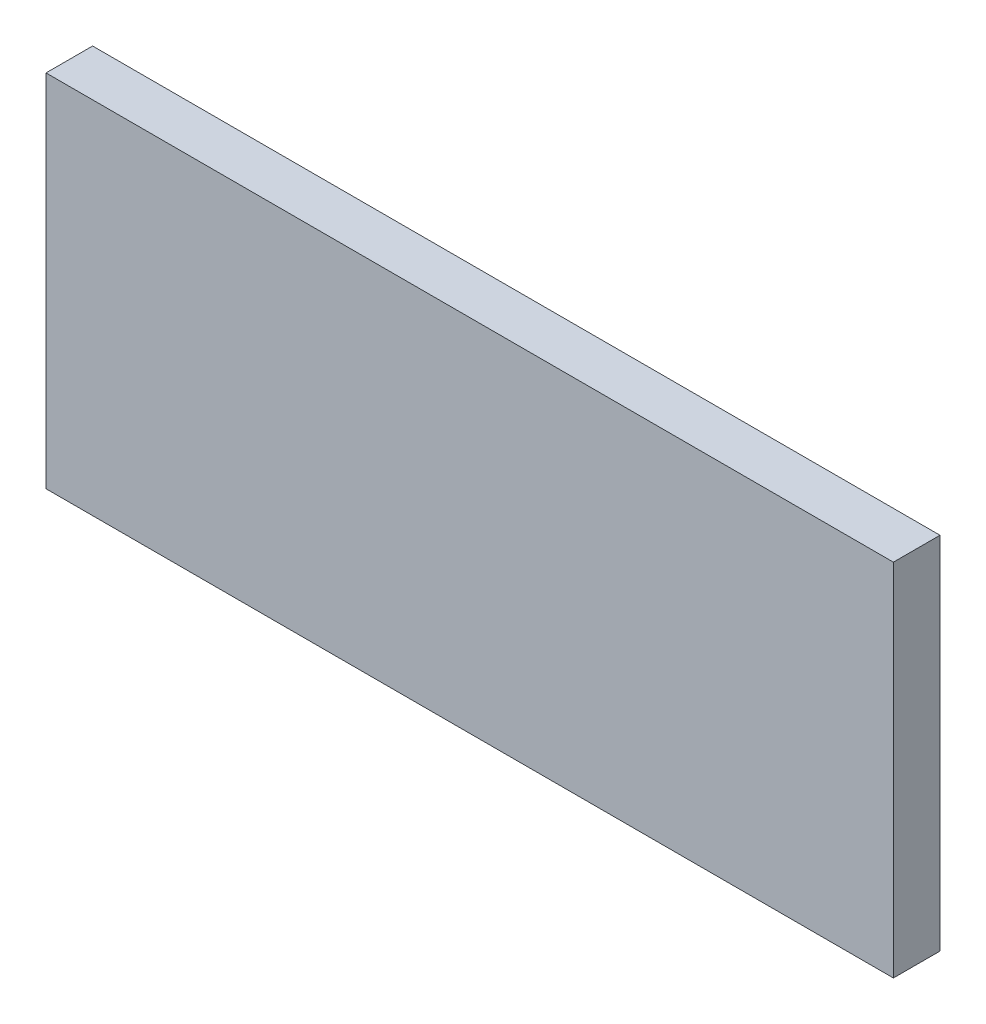
ISO-10303-21;
HEADER;
FILE_DESCRIPTION(('STEP AP214'),'2;1');
FILE_NAME('part.step','',(''),(''),'','','');
FILE_SCHEMA(('AUTOMOTIVE_DESIGN { 1 0 10303 214 1 1 1 1 }'));
ENDSEC;
DATA;
#1=APPLICATION_CONTEXT('core data for automotive mechanical design processes');
#2=APPLICATION_PROTOCOL_DEFINITION('international standard','automotive_design',2000,#1);
#3=PRODUCT_CONTEXT('',#1,'mechanical');
#4=PRODUCT('Part','Part','',(#3));
#5=PRODUCT_RELATED_PRODUCT_CATEGORY('part','',(#4));
#6=PRODUCT_DEFINITION_FORMATION('','',#4);
#7=PRODUCT_DEFINITION_CONTEXT('part definition',#1,'design');
#8=PRODUCT_DEFINITION('design','',#6,#7);
#9=PRODUCT_DEFINITION_SHAPE('','',#8);
#10=(LENGTH_UNIT() NAMED_UNIT(*) SI_UNIT(.MILLI.,.METRE.));
#11=(NAMED_UNIT(*) PLANE_ANGLE_UNIT() SI_UNIT($,.RADIAN.));
#12=(NAMED_UNIT(*) SI_UNIT($,.STERADIAN.) SOLID_ANGLE_UNIT());
#13=UNCERTAINTY_MEASURE_WITH_UNIT(LENGTH_MEASURE(1.E-05),#10,'distance_accuracy_value','');
#14=(GEOMETRIC_REPRESENTATION_CONTEXT(3) GLOBAL_UNCERTAINTY_ASSIGNED_CONTEXT((#13)) GLOBAL_UNIT_ASSIGNED_CONTEXT((#10,
#11,#12)) REPRESENTATION_CONTEXT('',''));
#15=CARTESIAN_POINT('',(0.,0.,0.));
#16=DIRECTION('',(0.,0.,1.));
#17=DIRECTION('',(1.,0.,0.));
#18=AXIS2_PLACEMENT_3D('',#15,#16,#17);
#19=CARTESIAN_POINT('',(50.8,-21.59,5.588));
#20=DIRECTION('',(-1.,0.,0.));
#21=DIRECTION('',(0.,0.,1.));
#22=AXIS2_PLACEMENT_3D('',#19,#20,#21);
#23=PLANE('',#22);
#24=DIRECTION('',(0.,1.,0.));
#25=VECTOR('',#24,1.);
#26=CARTESIAN_POINT('',(50.8,-21.59,0.));
#27=LINE('',#26,#25);
#28=CARTESIAN_POINT('',(50.8,-21.59,0.));
#29=VERTEX_POINT('',#28);
#30=CARTESIAN_POINT('',(50.8,21.59,0.));
#31=VERTEX_POINT('',#30);
#32=EDGE_CURVE('E96',#29,#31,#27,.T.);
#33=ORIENTED_EDGE('',*,*,#32,.T.);
#34=DIRECTION('',(0.,0.,-1.));
#35=VECTOR('',#34,1.);
#36=CARTESIAN_POINT('',(50.8,21.59,5.588));
#37=LINE('',#36,#35);
#38=CARTESIAN_POINT('',(50.8,21.59,5.588));
#39=VERTEX_POINT('',#38);
#40=EDGE_CURVE('E11',#39,#31,#37,.T.);
#41=ORIENTED_EDGE('',*,*,#40,.F.);
#42=DIRECTION('',(0.,1.,0.));
#43=VECTOR('',#42,1.);
#44=CARTESIAN_POINT('',(50.8,-21.59,5.588));
#45=LINE('',#44,#43);
#46=CARTESIAN_POINT('',(50.8,-21.59,5.588));
#47=VERTEX_POINT('',#46);
#48=EDGE_CURVE('E84',#47,#39,#45,.T.);
#49=ORIENTED_EDGE('',*,*,#48,.F.);
#50=DIRECTION('',(0.,0.,-1.));
#51=VECTOR('',#50,1.);
#52=CARTESIAN_POINT('',(50.8,-21.59,5.588));
#53=LINE('',#52,#51);
#54=EDGE_CURVE('E92',#47,#29,#53,.T.);
#55=ORIENTED_EDGE('',*,*,#54,.T.);
#56=EDGE_LOOP('',(#33,#41,#49,#55));
#57=FACE_BOUND('',#56,.T.);
#58=ADVANCED_FACE('F33',(#57),#23,.F.);
#59=CARTESIAN_POINT('',(-50.8,21.59,5.588));
#60=DIRECTION('',(0.,-1.,0.));
#61=DIRECTION('',(0.,0.,-1.));
#62=AXIS2_PLACEMENT_3D('',#59,#60,#61);
#63=PLANE('',#62);
#64=DIRECTION('',(-1.,0.,0.));
#65=VECTOR('',#64,1.);
#66=CARTESIAN_POINT('',(-50.8,21.59,0.));
#67=LINE('',#66,#65);
#68=CARTESIAN_POINT('',(-50.8,21.59,0.));
#69=VERTEX_POINT('',#68);
#70=EDGE_CURVE('E88',#31,#69,#67,.T.);
#71=ORIENTED_EDGE('',*,*,#70,.T.);
#72=DIRECTION('',(0.,0.,-1.));
#73=VECTOR('',#72,1.);
#74=CARTESIAN_POINT('',(-50.8,21.59,5.588));
#75=LINE('',#74,#73);
#76=CARTESIAN_POINT('',(-50.8,21.59,5.588));
#77=VERTEX_POINT('',#76);
#78=EDGE_CURVE('E41',#77,#69,#75,.T.);
#79=ORIENTED_EDGE('',*,*,#78,.F.);
#80=DIRECTION('',(-1.,0.,0.));
#81=VECTOR('',#80,1.);
#82=CARTESIAN_POINT('',(-50.8,21.59,5.588));
#83=LINE('',#82,#81);
#84=EDGE_CURVE('E79',#39,#77,#83,.T.);
#85=ORIENTED_EDGE('',*,*,#84,.F.);
#86=ORIENTED_EDGE('',*,*,#40,.T.);
#87=EDGE_LOOP('',(#71,#79,#85,#86));
#88=FACE_BOUND('',#87,.T.);
#89=ADVANCED_FACE('F87',(#88),#63,.F.);
#90=CARTESIAN_POINT('',(-50.8,-21.59,5.588));
#91=DIRECTION('',(1.,0.,0.));
#92=DIRECTION('',(0.,0.,-1.));
#93=AXIS2_PLACEMENT_3D('',#90,#91,#92);
#94=PLANE('',#93);
#95=DIRECTION('',(0.,-1.,0.));
#96=VECTOR('',#95,1.);
#97=CARTESIAN_POINT('',(-50.8,-21.59,0.));
#98=LINE('',#97,#96);
#99=CARTESIAN_POINT('',(-50.8,-21.59,0.));
#100=VERTEX_POINT('',#99);
#101=EDGE_CURVE('E66',#69,#100,#98,.T.);
#102=ORIENTED_EDGE('',*,*,#101,.T.);
#103=DIRECTION('',(0.,0.,-1.));
#104=VECTOR('',#103,1.);
#105=CARTESIAN_POINT('',(-50.8,-21.59,5.588));
#106=LINE('',#105,#104);
#107=CARTESIAN_POINT('',(-50.8,-21.59,5.588));
#108=VERTEX_POINT('',#107);
#109=EDGE_CURVE('E89',#108,#100,#106,.T.);
#110=ORIENTED_EDGE('',*,*,#109,.F.);
#111=DIRECTION('',(0.,-1.,0.));
#112=VECTOR('',#111,1.);
#113=CARTESIAN_POINT('',(-50.8,-21.59,5.588));
#114=LINE('',#113,#112);
#115=EDGE_CURVE('E82',#77,#108,#114,.T.);
#116=ORIENTED_EDGE('',*,*,#115,.F.);
#117=ORIENTED_EDGE('',*,*,#78,.T.);
#118=EDGE_LOOP('',(#102,#110,#116,#117));
#119=FACE_BOUND('',#118,.T.);
#120=ADVANCED_FACE('F90',(#119),#94,.F.);
#121=CARTESIAN_POINT('',(-50.8,-21.59,5.588));
#122=DIRECTION('',(0.,1.,0.));
#123=DIRECTION('',(0.,0.,1.));
#124=AXIS2_PLACEMENT_3D('',#121,#122,#123);
#125=PLANE('',#124);
#126=DIRECTION('',(1.,0.,0.));
#127=VECTOR('',#126,1.);
#128=CARTESIAN_POINT('',(-50.8,-21.59,0.));
#129=LINE('',#128,#127);
#130=EDGE_CURVE('E72',#100,#29,#129,.T.);
#131=ORIENTED_EDGE('',*,*,#130,.T.);
#132=ORIENTED_EDGE('',*,*,#54,.F.);
#133=DIRECTION('',(1.,0.,0.));
#134=VECTOR('',#133,1.);
#135=CARTESIAN_POINT('',(-50.8,-21.59,5.588));
#136=LINE('',#135,#134);
#137=EDGE_CURVE('E49',#108,#47,#136,.T.);
#138=ORIENTED_EDGE('',*,*,#137,.F.);
#139=ORIENTED_EDGE('',*,*,#109,.T.);
#140=EDGE_LOOP('',(#131,#132,#138,#139));
#141=FACE_BOUND('',#140,.T.);
#142=ADVANCED_FACE('F103',(#141),#125,.F.);
#143=CARTESIAN_POINT('',(0.,0.,5.588));
#144=DIRECTION('',(0.,0.,-1.));
#145=DIRECTION('',(-1.,0.,0.));
#146=AXIS2_PLACEMENT_3D('',#143,#144,#145);
#147=PLANE('',#146);
#148=ORIENTED_EDGE('',*,*,#48,.T.);
#149=ORIENTED_EDGE('',*,*,#84,.T.);
#150=ORIENTED_EDGE('',*,*,#115,.T.);
#151=ORIENTED_EDGE('',*,*,#137,.T.);
#152=EDGE_LOOP('',(#148,#149,#150,#151));
#153=FACE_BOUND('',#152,.T.);
#154=ADVANCED_FACE('F80',(#153),#147,.F.);
#155=CARTESIAN_POINT('',(0.,0.,0.));
#156=DIRECTION('',(0.,0.,-1.));
#157=DIRECTION('',(-1.,0.,0.));
#158=AXIS2_PLACEMENT_3D('',#155,#156,#157);
#159=PLANE('',#158);
#160=ORIENTED_EDGE('',*,*,#32,.F.);
#161=ORIENTED_EDGE('',*,*,#130,.F.);
#162=ORIENTED_EDGE('',*,*,#101,.F.);
#163=ORIENTED_EDGE('',*,*,#70,.F.);
#164=EDGE_LOOP('',(#160,#161,#162,#163));
#165=FACE_BOUND('',#164,.T.);
#166=ADVANCED_FACE('F106',(#165),#159,.T.);
#167=CLOSED_SHELL('',(#58,#89,#120,#142,#154,#166));
#168=MANIFOLD_SOLID_BREP('B2',#167);
#169=ADVANCED_BREP_SHAPE_REPRESENTATION('',(#18,#168),#14);
#170=SHAPE_DEFINITION_REPRESENTATION(#9,#169);
ENDSEC;
END-ISO-10303-21;
